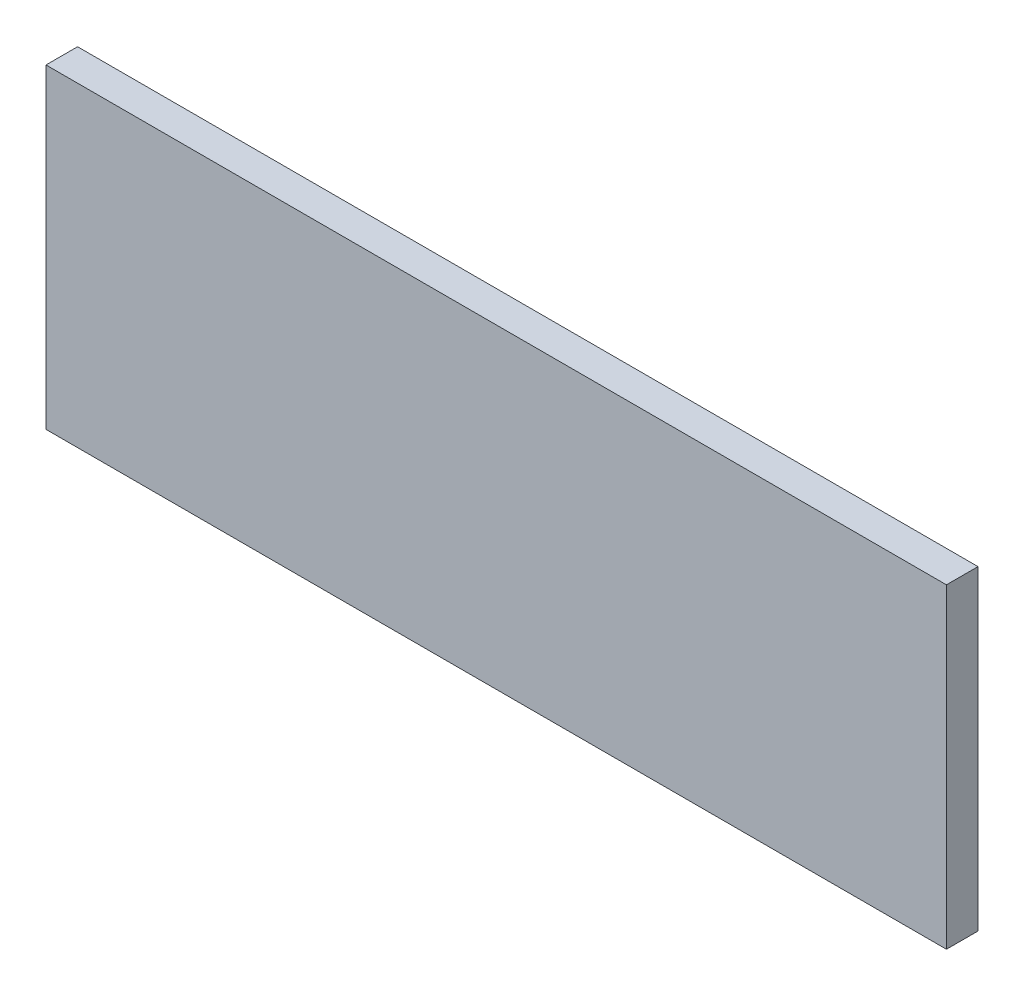
ISO-10303-21;
HEADER;
FILE_DESCRIPTION(('STEP AP214'),'2;1');
FILE_NAME('part.step','',(''),(''),'','','');
FILE_SCHEMA(('AUTOMOTIVE_DESIGN { 1 0 10303 214 1 1 1 1 }'));
ENDSEC;
DATA;
#1=APPLICATION_CONTEXT('core data for automotive mechanical design processes');
#2=APPLICATION_PROTOCOL_DEFINITION('international standard','automotive_design',2000,#1);
#3=PRODUCT_CONTEXT('',#1,'mechanical');
#4=PRODUCT('Part','Part','',(#3));
#5=PRODUCT_RELATED_PRODUCT_CATEGORY('part','',(#4));
#6=PRODUCT_DEFINITION_FORMATION('','',#4);
#7=PRODUCT_DEFINITION_CONTEXT('part definition',#1,'design');
#8=PRODUCT_DEFINITION('design','',#6,#7);
#9=PRODUCT_DEFINITION_SHAPE('','',#8);
#10=(LENGTH_UNIT() NAMED_UNIT(*) SI_UNIT(.MILLI.,.METRE.));
#11=(NAMED_UNIT(*) PLANE_ANGLE_UNIT() SI_UNIT($,.RADIAN.));
#12=(NAMED_UNIT(*) SI_UNIT($,.STERADIAN.) SOLID_ANGLE_UNIT());
#13=UNCERTAINTY_MEASURE_WITH_UNIT(LENGTH_MEASURE(1.E-05),#10,'distance_accuracy_value','');
#14=(GEOMETRIC_REPRESENTATION_CONTEXT(3) GLOBAL_UNCERTAINTY_ASSIGNED_CONTEXT((#13)) GLOBAL_UNIT_ASSIGNED_CONTEXT((#10,
#11,#12)) REPRESENTATION_CONTEXT('',''));
#15=CARTESIAN_POINT('',(0.,0.,0.));
#16=DIRECTION('',(0.,0.,1.));
#17=DIRECTION('',(1.,0.,0.));
#18=AXIS2_PLACEMENT_3D('',#15,#16,#17);
#19=CARTESIAN_POINT('',(0.,0.,0.));
#20=DIRECTION('',(0.,1.,0.));
#21=DIRECTION('',(0.,0.,1.));
#22=AXIS2_PLACEMENT_3D('',#19,#20,#21);
#23=PLANE('',#22);
#24=DIRECTION('',(1.,0.,0.));
#25=VECTOR('',#24,1.);
#26=CARTESIAN_POINT('',(-45.2882,0.,-36.83));
#27=LINE('',#26,#25);
#28=CARTESIAN_POINT('',(-45.2882,0.,-36.83));
#29=VERTEX_POINT('',#28);
#30=CARTESIAN_POINT('',(45.2882,0.,-36.83));
#31=VERTEX_POINT('',#30);
#32=EDGE_CURVE('E40',#29,#31,#27,.T.);
#33=ORIENTED_EDGE('',*,*,#32,.F.);
#34=DIRECTION('',(0.,0.,-1.));
#35=VECTOR('',#34,1.);
#36=CARTESIAN_POINT('',(-45.2882,0.,-36.83));
#37=LINE('',#36,#35);
#38=CARTESIAN_POINT('',(-45.2882,0.,-33.655));
#39=VERTEX_POINT('',#38);
#40=EDGE_CURVE('E63',#39,#29,#37,.T.);
#41=ORIENTED_EDGE('',*,*,#40,.F.);
#42=DIRECTION('',(-1.,0.,0.));
#43=VECTOR('',#42,1.);
#44=CARTESIAN_POINT('',(-45.2882,0.,-33.655));
#45=LINE('',#44,#43);
#46=CARTESIAN_POINT('',(45.2882,0.,-33.655));
#47=VERTEX_POINT('',#46);
#48=EDGE_CURVE('E68',#47,#39,#45,.T.);
#49=ORIENTED_EDGE('',*,*,#48,.F.);
#50=DIRECTION('',(0.,0.,1.));
#51=VECTOR('',#50,1.);
#52=CARTESIAN_POINT('',(45.2882,0.,-36.83));
#53=LINE('',#52,#51);
#54=EDGE_CURVE('E83',#31,#47,#53,.T.);
#55=ORIENTED_EDGE('',*,*,#54,.F.);
#56=EDGE_LOOP('',(#33,#41,#49,#55));
#57=FACE_BOUND('',#56,.T.);
#58=ADVANCED_FACE('F32',(#57),#23,.T.);
#59=CARTESIAN_POINT('',(0.,-31.75,0.));
#60=DIRECTION('',(0.,-1.,0.));
#61=DIRECTION('',(0.,0.,-1.));
#62=AXIS2_PLACEMENT_3D('',#59,#60,#61);
#63=PLANE('',#62);
#64=DIRECTION('',(1.,0.,0.));
#65=VECTOR('',#64,1.);
#66=CARTESIAN_POINT('',(-45.2882,-31.75,-36.83));
#67=LINE('',#66,#65);
#68=CARTESIAN_POINT('',(-45.2882,-31.75,-36.83));
#69=VERTEX_POINT('',#68);
#70=CARTESIAN_POINT('',(45.2882,-31.75,-36.83));
#71=VERTEX_POINT('',#70);
#72=EDGE_CURVE('E92',#69,#71,#67,.T.);
#73=ORIENTED_EDGE('',*,*,#72,.T.);
#74=DIRECTION('',(0.,0.,1.));
#75=VECTOR('',#74,1.);
#76=CARTESIAN_POINT('',(45.2882,-31.75,-36.83));
#77=LINE('',#76,#75);
#78=CARTESIAN_POINT('',(45.2882,-31.75,-33.655));
#79=VERTEX_POINT('',#78);
#80=EDGE_CURVE('E81',#71,#79,#77,.T.);
#81=ORIENTED_EDGE('',*,*,#80,.T.);
#82=DIRECTION('',(-1.,0.,0.));
#83=VECTOR('',#82,1.);
#84=CARTESIAN_POINT('',(-45.2882,-31.75,-33.655));
#85=LINE('',#84,#83);
#86=CARTESIAN_POINT('',(-45.2882,-31.75,-33.655));
#87=VERTEX_POINT('',#86);
#88=EDGE_CURVE('E84',#79,#87,#85,.T.);
#89=ORIENTED_EDGE('',*,*,#88,.T.);
#90=DIRECTION('',(0.,0.,-1.));
#91=VECTOR('',#90,1.);
#92=CARTESIAN_POINT('',(-45.2882,-31.75,-36.83));
#93=LINE('',#92,#91);
#94=EDGE_CURVE('E89',#87,#69,#93,.T.);
#95=ORIENTED_EDGE('',*,*,#94,.T.);
#96=EDGE_LOOP('',(#73,#81,#89,#95));
#97=FACE_BOUND('',#96,.T.);
#98=ADVANCED_FACE('F91',(#97),#63,.T.);
#99=CARTESIAN_POINT('',(45.2882,90.6320300002157,-36.83));
#100=DIRECTION('',(1.,0.,0.));
#101=DIRECTION('',(0.,0.,-1.));
#102=AXIS2_PLACEMENT_3D('',#99,#100,#101);
#103=PLANE('',#102);
#104=DIRECTION('',(0.,-1.,0.));
#105=VECTOR('',#104,1.);
#106=CARTESIAN_POINT('',(45.2882,90.6320300002157,-36.83));
#107=LINE('',#106,#105);
#108=EDGE_CURVE('E11',#31,#71,#107,.T.);
#109=ORIENTED_EDGE('',*,*,#108,.F.);
#110=ORIENTED_EDGE('',*,*,#54,.T.);
#111=DIRECTION('',(0.,-1.,0.));
#112=VECTOR('',#111,1.);
#113=CARTESIAN_POINT('',(45.2882,90.6320300002157,-33.655));
#114=LINE('',#113,#112);
#115=EDGE_CURVE('E78',#47,#79,#114,.T.);
#116=ORIENTED_EDGE('',*,*,#115,.T.);
#117=ORIENTED_EDGE('',*,*,#80,.F.);
#118=EDGE_LOOP('',(#109,#110,#116,#117));
#119=FACE_BOUND('',#118,.T.);
#120=ADVANCED_FACE('F79',(#119),#103,.T.);
#121=CARTESIAN_POINT('',(-45.2882,90.6320300002157,-33.655));
#122=DIRECTION('',(0.,0.,1.));
#123=DIRECTION('',(1.,0.,0.));
#124=AXIS2_PLACEMENT_3D('',#121,#122,#123);
#125=PLANE('',#124);
#126=ORIENTED_EDGE('',*,*,#115,.F.);
#127=ORIENTED_EDGE('',*,*,#48,.T.);
#128=DIRECTION('',(0.,-1.,0.));
#129=VECTOR('',#128,1.);
#130=CARTESIAN_POINT('',(-45.2882,90.6320300002157,-33.655));
#131=LINE('',#130,#129);
#132=EDGE_CURVE('E73',#39,#87,#131,.T.);
#133=ORIENTED_EDGE('',*,*,#132,.T.);
#134=ORIENTED_EDGE('',*,*,#88,.F.);
#135=EDGE_LOOP('',(#126,#127,#133,#134));
#136=FACE_BOUND('',#135,.T.);
#137=ADVANCED_FACE('F85',(#136),#125,.T.);
#138=CARTESIAN_POINT('',(-45.2882,90.6320300002157,-36.83));
#139=DIRECTION('',(-1.,0.,0.));
#140=DIRECTION('',(0.,0.,1.));
#141=AXIS2_PLACEMENT_3D('',#138,#139,#140);
#142=PLANE('',#141);
#143=ORIENTED_EDGE('',*,*,#132,.F.);
#144=ORIENTED_EDGE('',*,*,#40,.T.);
#145=DIRECTION('',(0.,-1.,0.));
#146=VECTOR('',#145,1.);
#147=CARTESIAN_POINT('',(-45.2882,90.6320300002157,-36.83));
#148=LINE('',#147,#146);
#149=EDGE_CURVE('E99',#29,#69,#148,.T.);
#150=ORIENTED_EDGE('',*,*,#149,.T.);
#151=ORIENTED_EDGE('',*,*,#94,.F.);
#152=EDGE_LOOP('',(#143,#144,#150,#151));
#153=FACE_BOUND('',#152,.T.);
#154=ADVANCED_FACE('F105',(#153),#142,.T.);
#155=CARTESIAN_POINT('',(-45.2882,90.6320300002157,-36.83));
#156=DIRECTION('',(0.,0.,-1.));
#157=DIRECTION('',(-1.,0.,0.));
#158=AXIS2_PLACEMENT_3D('',#155,#156,#157);
#159=PLANE('',#158);
#160=ORIENTED_EDGE('',*,*,#149,.F.);
#161=ORIENTED_EDGE('',*,*,#32,.T.);
#162=ORIENTED_EDGE('',*,*,#108,.T.);
#163=ORIENTED_EDGE('',*,*,#72,.F.);
#164=EDGE_LOOP('',(#160,#161,#162,#163));
#165=FACE_BOUND('',#164,.T.);
#166=ADVANCED_FACE('F106',(#165),#159,.T.);
#167=CLOSED_SHELL('',(#58,#98,#120,#137,#154,#166));
#168=MANIFOLD_SOLID_BREP('B2',#167);
#169=ADVANCED_BREP_SHAPE_REPRESENTATION('',(#18,#168),#14);
#170=SHAPE_DEFINITION_REPRESENTATION(#9,#169);
ENDSEC;
END-ISO-10303-21;
